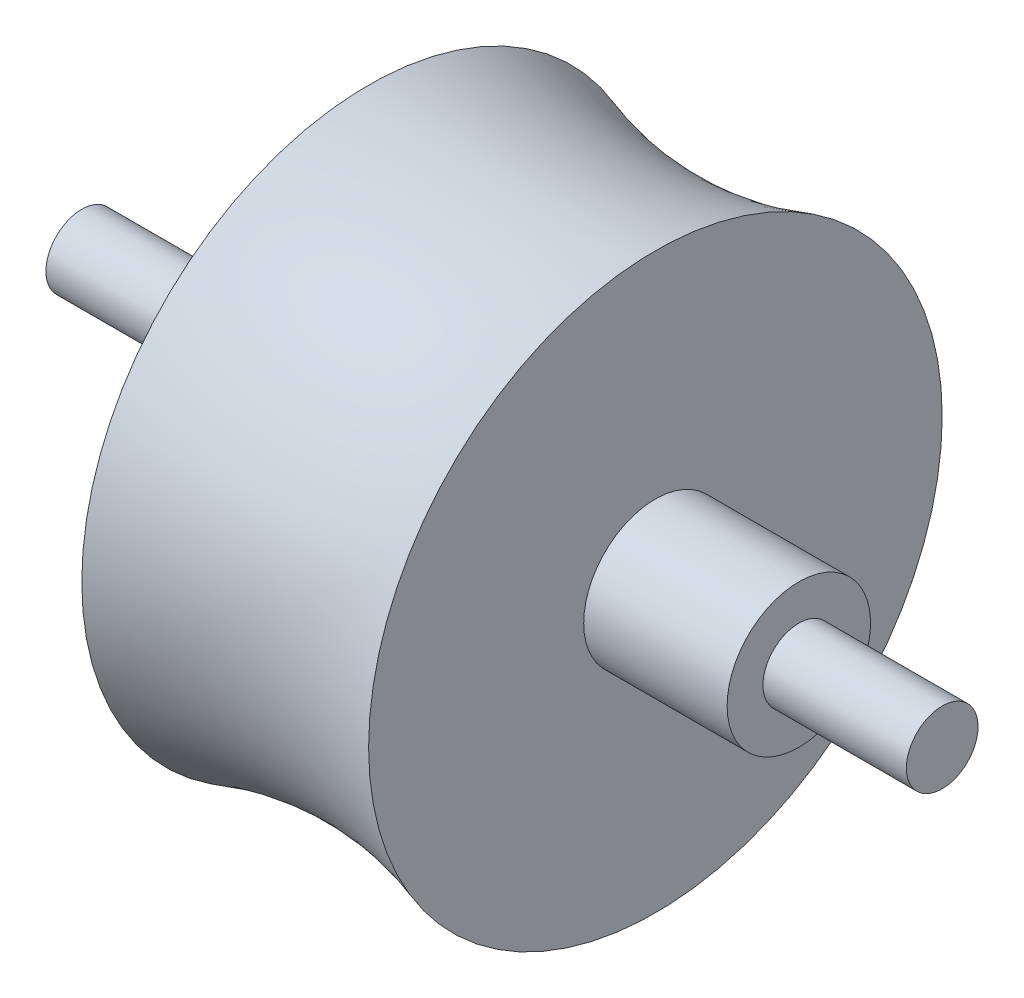
ISO-10303-21;
HEADER;
FILE_DESCRIPTION(('STEP AP214'),'2;1');
FILE_NAME('part.step','',(''),(''),'','','');
FILE_SCHEMA(('AUTOMOTIVE_DESIGN { 1 0 10303 214 1 1 1 1 }'));
ENDSEC;
DATA;
#1=APPLICATION_CONTEXT('core data for automotive mechanical design processes');
#2=APPLICATION_PROTOCOL_DEFINITION('international standard','automotive_design',2000,#1);
#3=PRODUCT_CONTEXT('',#1,'mechanical');
#4=PRODUCT('Part','Part','',(#3));
#5=PRODUCT_RELATED_PRODUCT_CATEGORY('part','',(#4));
#6=PRODUCT_DEFINITION_FORMATION('','',#4);
#7=PRODUCT_DEFINITION_CONTEXT('part definition',#1,'design');
#8=PRODUCT_DEFINITION('design','',#6,#7);
#9=PRODUCT_DEFINITION_SHAPE('','',#8);
#10=(LENGTH_UNIT() NAMED_UNIT(*) SI_UNIT(.MILLI.,.METRE.));
#11=(NAMED_UNIT(*) PLANE_ANGLE_UNIT() SI_UNIT($,.RADIAN.));
#12=(NAMED_UNIT(*) SI_UNIT($,.STERADIAN.) SOLID_ANGLE_UNIT());
#13=UNCERTAINTY_MEASURE_WITH_UNIT(LENGTH_MEASURE(1.E-05),#10,'distance_accuracy_value','');
#14=(GEOMETRIC_REPRESENTATION_CONTEXT(3) GLOBAL_UNCERTAINTY_ASSIGNED_CONTEXT((#13)) GLOBAL_UNIT_ASSIGNED_CONTEXT((#10,
#11,#12)) REPRESENTATION_CONTEXT('',''));
#15=CARTESIAN_POINT('',(0.,0.,0.));
#16=DIRECTION('',(0.,0.,1.));
#17=DIRECTION('',(1.,0.,0.));
#18=AXIS2_PLACEMENT_3D('',#15,#16,#17);
#19=CARTESIAN_POINT('',(19.05,0.,0.));
#20=DIRECTION('',(1.,0.,0.));
#21=DIRECTION('',(0.,0.,-1.));
#22=AXIS2_PLACEMENT_3D('',#19,#20,#21);
#23=PLANE('',#22);
#24=CARTESIAN_POINT('',(19.05,0.,0.));
#25=DIRECTION('',(-1.,0.,0.));
#26=DIRECTION('',(0.,0.,1.));
#27=AXIS2_PLACEMENT_3D('',#24,#25,#26);
#28=CIRCLE('',#27,1.5875);
#29=CARTESIAN_POINT('',(19.05,0.,1.5875));
#30=VERTEX_POINT('',#29);
#31=EDGE_CURVE('E64',#30,#30,#28,.T.);
#32=ORIENTED_EDGE('',*,*,#31,.F.);
#33=EDGE_LOOP('',(#32));
#34=FACE_BOUND('',#33,.T.);
#35=ADVANCED_FACE('F15',(#34),#23,.T.);
#36=CARTESIAN_POINT('',(-19.05,0.,0.));
#37=DIRECTION('',(-1.,0.,0.));
#38=DIRECTION('',(0.,0.,1.));
#39=AXIS2_PLACEMENT_3D('',#36,#37,#38);
#40=PLANE('',#39);
#41=CARTESIAN_POINT('',(-19.05,0.,0.));
#42=DIRECTION('',(1.,0.,0.));
#43=DIRECTION('',(0.,0.,-1.));
#44=AXIS2_PLACEMENT_3D('',#41,#42,#43);
#45=CIRCLE('',#44,1.5875);
#46=CARTESIAN_POINT('',(-19.05,0.,-1.5875));
#47=VERTEX_POINT('',#46);
#48=EDGE_CURVE('E59',#47,#47,#45,.T.);
#49=ORIENTED_EDGE('',*,*,#48,.F.);
#50=EDGE_LOOP('',(#49));
#51=FACE_BOUND('',#50,.T.);
#52=ADVANCED_FACE('F72',(#51),#40,.T.);
#53=CARTESIAN_POINT('',(19.05,0.,0.));
#54=DIRECTION('',(-1.,0.,0.));
#55=DIRECTION('',(0.,0.,1.));
#56=AXIS2_PLACEMENT_3D('',#53,#54,#55);
#57=CYLINDRICAL_SURFACE('',#56,1.5875);
#58=CARTESIAN_POINT('',(12.7,0.,0.));
#59=DIRECTION('',(-1.,0.,0.));
#60=DIRECTION('',(0.,0.,1.));
#61=AXIS2_PLACEMENT_3D('',#58,#59,#60);
#62=CIRCLE('',#61,1.5875);
#63=CARTESIAN_POINT('',(12.7,0.,1.5875));
#64=VERTEX_POINT('',#63);
#65=EDGE_CURVE('E54',#64,#64,#62,.T.);
#66=ORIENTED_EDGE('',*,*,#65,.F.);
#67=EDGE_LOOP('',(#66));
#68=FACE_BOUND('',#67,.T.);
#69=ORIENTED_EDGE('',*,*,#31,.T.);
#70=EDGE_LOOP('',(#69));
#71=FACE_BOUND('',#70,.T.);
#72=ADVANCED_FACE('F69',(#68,#71),#57,.T.);
#73=CARTESIAN_POINT('',(-19.05,0.,0.));
#74=DIRECTION('',(1.,0.,0.));
#75=DIRECTION('',(0.,0.,-1.));
#76=AXIS2_PLACEMENT_3D('',#73,#74,#75);
#77=CYLINDRICAL_SURFACE('',#76,1.5875);
#78=CARTESIAN_POINT('',(-12.7,0.,0.));
#79=DIRECTION('',(1.,0.,0.));
#80=DIRECTION('',(0.,0.,-1.));
#81=AXIS2_PLACEMENT_3D('',#78,#79,#80);
#82=CIRCLE('',#81,1.5875);
#83=CARTESIAN_POINT('',(-12.7,0.,-1.5875));
#84=VERTEX_POINT('',#83);
#85=EDGE_CURVE('E49',#84,#84,#82,.F.);
#86=ORIENTED_EDGE('',*,*,#85,.T.);
#87=EDGE_LOOP('',(#86));
#88=FACE_BOUND('',#87,.T.);
#89=ORIENTED_EDGE('',*,*,#48,.T.);
#90=EDGE_LOOP('',(#89));
#91=FACE_BOUND('',#90,.T.);
#92=ADVANCED_FACE('F108',(#88,#91),#77,.T.);
#93=CARTESIAN_POINT('',(12.7,0.,0.));
#94=DIRECTION('',(1.,0.,0.));
#95=DIRECTION('',(0.,0.,-1.));
#96=AXIS2_PLACEMENT_3D('',#93,#94,#95);
#97=PLANE('',#96);
#98=CARTESIAN_POINT('',(12.7,0.,0.));
#99=DIRECTION('',(-1.,0.,0.));
#100=DIRECTION('',(0.,0.,1.));
#101=AXIS2_PLACEMENT_3D('',#98,#99,#100);
#102=CIRCLE('',#101,3.175);
#103=CARTESIAN_POINT('',(12.7,0.,3.175));
#104=VERTEX_POINT('',#103);
#105=EDGE_CURVE('E44',#104,#104,#102,.T.);
#106=ORIENTED_EDGE('',*,*,#105,.F.);
#107=EDGE_LOOP('',(#106));
#108=FACE_BOUND('',#107,.T.);
#109=ORIENTED_EDGE('',*,*,#65,.T.);
#110=EDGE_LOOP('',(#109));
#111=FACE_BOUND('',#110,.T.);
#112=ADVANCED_FACE('F104',(#108,#111),#97,.T.);
#113=CARTESIAN_POINT('',(-12.7,0.,0.));
#114=DIRECTION('',(1.,0.,0.));
#115=DIRECTION('',(0.,0.,-1.));
#116=AXIS2_PLACEMENT_3D('',#113,#114,#115);
#117=PLANE('',#116);
#118=CARTESIAN_POINT('',(-12.7,0.,0.));
#119=DIRECTION('',(-1.,0.,0.));
#120=DIRECTION('',(0.,0.,1.));
#121=AXIS2_PLACEMENT_3D('',#118,#119,#120);
#122=CIRCLE('',#121,3.175);
#123=CARTESIAN_POINT('',(-12.7,0.,3.175));
#124=VERTEX_POINT('',#123);
#125=EDGE_CURVE('E39',#124,#124,#122,.F.);
#126=ORIENTED_EDGE('',*,*,#125,.F.);
#127=EDGE_LOOP('',(#126));
#128=FACE_BOUND('',#127,.T.);
#129=ORIENTED_EDGE('',*,*,#85,.F.);
#130=EDGE_LOOP('',(#129));
#131=FACE_BOUND('',#130,.T.);
#132=ADVANCED_FACE('F100',(#128,#131),#117,.F.);
#133=CARTESIAN_POINT('',(12.7,0.,0.));
#134=DIRECTION('',(-1.,0.,0.));
#135=DIRECTION('',(0.,0.,1.));
#136=AXIS2_PLACEMENT_3D('',#133,#134,#135);
#137=CYLINDRICAL_SURFACE('',#136,3.175);
#138=CARTESIAN_POINT('',(6.35,0.,0.));
#139=DIRECTION('',(-1.,0.,0.));
#140=DIRECTION('',(0.,0.,1.));
#141=AXIS2_PLACEMENT_3D('',#138,#139,#140);
#142=CIRCLE('',#141,3.175);
#143=CARTESIAN_POINT('',(6.35,0.,3.175));
#144=VERTEX_POINT('',#143);
#145=EDGE_CURVE('E34',#144,#144,#142,.F.);
#146=ORIENTED_EDGE('',*,*,#145,.T.);
#147=EDGE_LOOP('',(#146));
#148=FACE_BOUND('',#147,.T.);
#149=ORIENTED_EDGE('',*,*,#105,.T.);
#150=EDGE_LOOP('',(#149));
#151=FACE_BOUND('',#150,.T.);
#152=ADVANCED_FACE('F96',(#148,#151),#137,.T.);
#153=CARTESIAN_POINT('',(12.7,0.,0.));
#154=DIRECTION('',(-1.,0.,0.));
#155=DIRECTION('',(0.,0.,1.));
#156=AXIS2_PLACEMENT_3D('',#153,#154,#155);
#157=CYLINDRICAL_SURFACE('',#156,3.175);
#158=ORIENTED_EDGE('',*,*,#125,.T.);
#159=EDGE_LOOP('',(#158));
#160=FACE_BOUND('',#159,.T.);
#161=CARTESIAN_POINT('',(-6.35,0.,0.));
#162=DIRECTION('',(-1.,0.,0.));
#163=DIRECTION('',(0.,0.,1.));
#164=AXIS2_PLACEMENT_3D('',#161,#162,#163);
#165=CIRCLE('',#164,3.175);
#166=CARTESIAN_POINT('',(-6.35,0.,3.175));
#167=VERTEX_POINT('',#166);
#168=EDGE_CURVE('E27',#167,#167,#165,.F.);
#169=ORIENTED_EDGE('',*,*,#168,.F.);
#170=EDGE_LOOP('',(#169));
#171=FACE_BOUND('',#170,.T.);
#172=ADVANCED_FACE('F92',(#160,#171),#157,.T.);
#173=CARTESIAN_POINT('',(6.35,0.,6.35));
#174=DIRECTION('',(-1.,0.,0.));
#175=DIRECTION('',(0.,0.,1.));
#176=AXIS2_PLACEMENT_3D('',#173,#174,#175);
#177=PLANE('',#176);
#178=CARTESIAN_POINT('',(6.35,0.,0.));
#179=DIRECTION('',(-1.,0.,0.));
#180=DIRECTION('',(0.,0.,1.));
#181=AXIS2_PLACEMENT_3D('',#178,#179,#180);
#182=CIRCLE('',#181,12.7000000000001);
#183=CARTESIAN_POINT('',(6.35,0.,12.7000000000001));
#184=VERTEX_POINT('',#183);
#185=EDGE_CURVE('E22',#184,#184,#182,.F.);
#186=ORIENTED_EDGE('',*,*,#185,.T.);
#187=EDGE_LOOP('',(#186));
#188=FACE_BOUND('',#187,.T.);
#189=ORIENTED_EDGE('',*,*,#145,.F.);
#190=EDGE_LOOP('',(#189));
#191=FACE_BOUND('',#190,.T.);
#192=ADVANCED_FACE('F86',(#188,#191),#177,.F.);
#193=CARTESIAN_POINT('',(-6.35,0.,6.35));
#194=DIRECTION('',(-1.,0.,0.));
#195=DIRECTION('',(0.,0.,1.));
#196=AXIS2_PLACEMENT_3D('',#193,#194,#195);
#197=PLANE('',#196);
#198=CARTESIAN_POINT('',(-6.35,0.,0.));
#199=DIRECTION('',(-1.,0.,0.));
#200=DIRECTION('',(0.,0.,1.));
#201=AXIS2_PLACEMENT_3D('',#198,#199,#200);
#202=CIRCLE('',#201,12.7000000000001);
#203=CARTESIAN_POINT('',(-6.35,0.,12.7000000000001));
#204=VERTEX_POINT('',#203);
#205=EDGE_CURVE('E10',#204,#204,#202,.T.);
#206=ORIENTED_EDGE('',*,*,#205,.T.);
#207=EDGE_LOOP('',(#206));
#208=FACE_BOUND('',#207,.T.);
#209=ORIENTED_EDGE('',*,*,#168,.T.);
#210=EDGE_LOOP('',(#209));
#211=FACE_BOUND('',#210,.T.);
#212=ADVANCED_FACE('F80',(#208,#211),#197,.T.);
#213=CARTESIAN_POINT('',(0.,0.,0.));
#214=DIRECTION('',(-1.,0.,0.));
#215=DIRECTION('',(0.,0.,1.));
#216=AXIS2_PLACEMENT_3D('',#213,#214,#215);
#217=TOROIDAL_SURFACE('',#216,31.6651654356086,20.);
#218=ORIENTED_EDGE('',*,*,#205,.F.);
#219=EDGE_LOOP('',(#218));
#220=FACE_BOUND('',#219,.T.);
#221=ORIENTED_EDGE('',*,*,#185,.F.);
#222=EDGE_LOOP('',(#221));
#223=FACE_BOUND('',#222,.T.);
#224=ADVANCED_FACE('F78',(#220,#223),#217,.F.);
#225=CLOSED_SHELL('',(#35,#52,#72,#92,#112,#132,#152,#172,#192,#212,#224));
#226=MANIFOLD_SOLID_BREP('B1',#225);
#227=ADVANCED_BREP_SHAPE_REPRESENTATION('',(#18,#226),#14);
#228=SHAPE_DEFINITION_REPRESENTATION(#9,#227);
ENDSEC;
END-ISO-10303-21;
